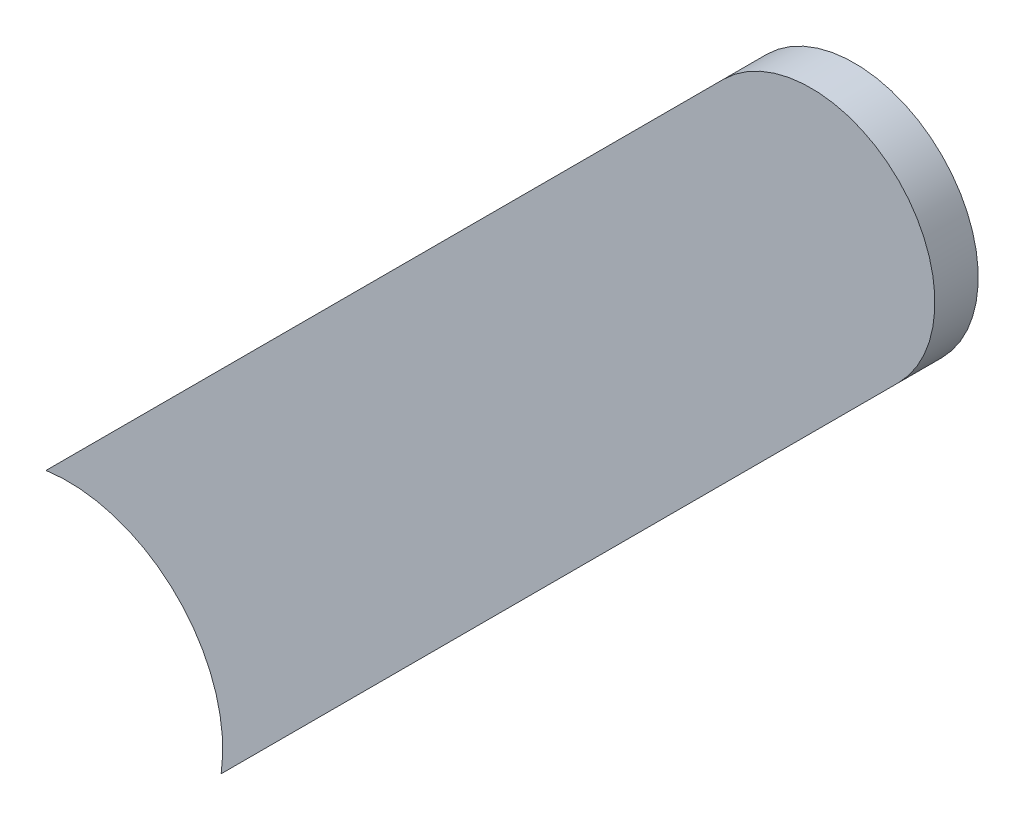
ISO-10303-21;
HEADER;
FILE_DESCRIPTION(('STEP AP214'),'2;1');
FILE_NAME('part.step','',(''),(''),'','','');
FILE_SCHEMA(('AUTOMOTIVE_DESIGN { 1 0 10303 214 1 1 1 1 }'));
ENDSEC;
DATA;
#1=APPLICATION_CONTEXT('core data for automotive mechanical design processes');
#2=APPLICATION_PROTOCOL_DEFINITION('international standard','automotive_design',2000,#1);
#3=PRODUCT_CONTEXT('',#1,'mechanical');
#4=PRODUCT('Part','Part','',(#3));
#5=PRODUCT_RELATED_PRODUCT_CATEGORY('part','',(#4));
#6=PRODUCT_DEFINITION_FORMATION('','',#4);
#7=PRODUCT_DEFINITION_CONTEXT('part definition',#1,'design');
#8=PRODUCT_DEFINITION('design','',#6,#7);
#9=PRODUCT_DEFINITION_SHAPE('','',#8);
#10=(LENGTH_UNIT() NAMED_UNIT(*) SI_UNIT(.MILLI.,.METRE.));
#11=(NAMED_UNIT(*) PLANE_ANGLE_UNIT() SI_UNIT($,.RADIAN.));
#12=(NAMED_UNIT(*) SI_UNIT($,.STERADIAN.) SOLID_ANGLE_UNIT());
#13=UNCERTAINTY_MEASURE_WITH_UNIT(LENGTH_MEASURE(1.E-05),#10,'distance_accuracy_value','');
#14=(GEOMETRIC_REPRESENTATION_CONTEXT(3) GLOBAL_UNCERTAINTY_ASSIGNED_CONTEXT((#13)) GLOBAL_UNIT_ASSIGNED_CONTEXT((#10,
#11,#12)) REPRESENTATION_CONTEXT('',''));
#15=CARTESIAN_POINT('',(0.,0.,0.));
#16=DIRECTION('',(0.,0.,1.));
#17=DIRECTION('',(1.,0.,0.));
#18=AXIS2_PLACEMENT_3D('',#15,#16,#17);
#19=CARTESIAN_POINT('',(90.629289,-121.979289,1.6));
#20=DIRECTION('',(0.707106781186548,-0.707106781186548,0.));
#21=DIRECTION('',(0.,0.,-1.));
#22=AXIS2_PLACEMENT_3D('',#19,#20,#21);
#23=PLANE('',#22);
#24=DIRECTION('',(0.,0.,-1.));
#25=VECTOR('',#24,1.);
#26=CARTESIAN_POINT('',(90.082321579411,-122.5262564205,-0.045));
#27=LINE('',#26,#25);
#28=CARTESIAN_POINT('',(90.082321579386,-122.5262564206,1.635));
#29=VERTEX_POINT('',#28);
#30=CARTESIAN_POINT('',(90.082321579386,-122.5262564206,1.6));
#31=VERTEX_POINT('',#30);
#32=EDGE_CURVE('E11',#29,#31,#27,.T.);
#33=ORIENTED_EDGE('',*,*,#32,.F.);
#34=DIRECTION('',(-0.707106781186548,-0.707106781186548,0.));
#35=VECTOR('',#34,1.);
#36=CARTESIAN_POINT('',(90.629289,-121.979289,1.635));
#37=LINE('',#36,#35);
#38=CARTESIAN_POINT('',(90.629289,-121.979289,1.635));
#39=VERTEX_POINT('',#38);
#40=EDGE_CURVE('E26',#39,#29,#37,.T.);
#41=ORIENTED_EDGE('',*,*,#40,.F.);
#42=DIRECTION('',(0.,0.,1.));
#43=VECTOR('',#42,1.);
#44=CARTESIAN_POINT('',(90.629289,-121.979289,1.6));
#45=LINE('',#44,#43);
#46=CARTESIAN_POINT('',(90.629289,-121.979289,1.6));
#47=VERTEX_POINT('',#46);
#48=EDGE_CURVE('E67',#47,#39,#45,.T.);
#49=ORIENTED_EDGE('',*,*,#48,.F.);
#50=DIRECTION('',(-0.707106781186548,-0.707106781186548,0.));
#51=VECTOR('',#50,1.);
#52=CARTESIAN_POINT('',(90.629289,-121.979289,1.6));
#53=LINE('',#52,#51);
#54=EDGE_CURVE('E70',#47,#31,#53,.T.);
#55=ORIENTED_EDGE('',*,*,#54,.T.);
#56=EDGE_LOOP('',(#33,#41,#49,#55));
#57=FACE_BOUND('',#56,.T.);
#58=ADVANCED_FACE('F17',(#57),#23,.F.);
#59=CARTESIAN_POINT('',(90.1,-122.65,-0.045));
#60=DIRECTION('',(0.,0.,-1.));
#61=DIRECTION('',(0.,-1.,0.));
#62=AXIS2_PLACEMENT_3D('',#59,#60,#61);
#63=CYLINDRICAL_SURFACE('',#62,0.125);
#64=DIRECTION('',(0.,0.,-1.));
#65=VECTOR('',#64,1.);
#66=CARTESIAN_POINT('',(90.223743912735,-122.6676760872,-0.045));
#67=LINE('',#66,#65);
#68=CARTESIAN_POINT('',(90.223743912733,-122.6676760872,1.635));
#69=VERTEX_POINT('',#68);
#70=CARTESIAN_POINT('',(90.223743912733,-122.6676760872,1.6));
#71=VERTEX_POINT('',#70);
#72=EDGE_CURVE('E95',#69,#71,#67,.T.);
#73=ORIENTED_EDGE('',*,*,#72,.F.);
#74=CARTESIAN_POINT('',(90.1,-122.65,1.635));
#75=DIRECTION('',(0.,0.,-1.));
#76=DIRECTION('',(0.,-1.,0.));
#77=AXIS2_PLACEMENT_3D('',#74,#75,#76);
#78=CIRCLE('',#77,0.125);
#79=EDGE_CURVE('E20',#29,#69,#78,.T.);
#80=ORIENTED_EDGE('',*,*,#79,.F.);
#81=ORIENTED_EDGE('',*,*,#32,.T.);
#82=CARTESIAN_POINT('',(90.1,-122.65,1.6));
#83=DIRECTION('',(0.,0.,-1.));
#84=DIRECTION('',(0.,-1.,0.));
#85=AXIS2_PLACEMENT_3D('',#82,#83,#84);
#86=CIRCLE('',#85,0.125);
#87=EDGE_CURVE('E74',#31,#71,#86,.T.);
#88=ORIENTED_EDGE('',*,*,#87,.T.);
#89=EDGE_LOOP('',(#73,#80,#81,#88));
#90=FACE_BOUND('',#89,.T.);
#91=ADVANCED_FACE('F126',(#90),#63,.F.);
#92=CARTESIAN_POINT('',(90.17071,-122.72071,1.635));
#93=DIRECTION('',(0.,0.,1.));
#94=DIRECTION('',(1.,0.,0.));
#95=AXIS2_PLACEMENT_3D('',#92,#93,#94);
#96=PLANE('',#95);
#97=ORIENTED_EDGE('',*,*,#79,.T.);
#98=DIRECTION('',(0.707106781186548,0.707106781186548,0.));
#99=VECTOR('',#98,1.);
#100=CARTESIAN_POINT('',(90.17071,-122.72071,1.635));
#101=LINE('',#100,#99);
#102=CARTESIAN_POINT('',(90.77071,-122.12071,1.635));
#103=VERTEX_POINT('',#102);
#104=EDGE_CURVE('E115',#69,#103,#101,.T.);
#105=ORIENTED_EDGE('',*,*,#104,.T.);
#106=CARTESIAN_POINT('',(90.6999995,-122.0499995,1.635));
#107=DIRECTION('',(0.,0.,1.));
#108=DIRECTION('',(0.707106781186548,-0.707106781186548,0.));
#109=AXIS2_PLACEMENT_3D('',#106,#107,#108);
#110=CIRCLE('',#109,0.09999974810219);
#111=EDGE_CURVE('E73',#103,#39,#110,.T.);
#112=ORIENTED_EDGE('',*,*,#111,.T.);
#113=ORIENTED_EDGE('',*,*,#40,.T.);
#114=EDGE_LOOP('',(#97,#105,#112,#113));
#115=FACE_BOUND('',#114,.T.);
#116=ADVANCED_FACE('F128',(#115),#96,.T.);
#117=CARTESIAN_POINT('',(90.6999995,-122.0499995,1.6));
#118=DIRECTION('',(0.,0.,-1.));
#119=DIRECTION('',(0.707106781186548,-0.707106781186548,0.));
#120=AXIS2_PLACEMENT_3D('',#117,#118,#119);
#121=CYLINDRICAL_SURFACE('',#120,0.09999974810219);
#122=CARTESIAN_POINT('',(90.6999995,-122.0499995,1.6));
#123=DIRECTION('',(0.,0.,1.));
#124=DIRECTION('',(0.707106781186548,-0.707106781186548,0.));
#125=AXIS2_PLACEMENT_3D('',#122,#123,#124);
#126=CIRCLE('',#125,0.09999974810219);
#127=CARTESIAN_POINT('',(90.77071,-122.12071,1.6));
#128=VERTEX_POINT('',#127);
#129=EDGE_CURVE('E77',#128,#47,#126,.T.);
#130=ORIENTED_EDGE('',*,*,#129,.T.);
#131=ORIENTED_EDGE('',*,*,#48,.T.);
#132=ORIENTED_EDGE('',*,*,#111,.F.);
#133=DIRECTION('',(0.,0.,1.));
#134=VECTOR('',#133,1.);
#135=CARTESIAN_POINT('',(90.77071,-122.12071,1.6));
#136=LINE('',#135,#134);
#137=EDGE_CURVE('E80',#128,#103,#136,.T.);
#138=ORIENTED_EDGE('',*,*,#137,.F.);
#139=EDGE_LOOP('',(#130,#131,#132,#138));
#140=FACE_BOUND('',#139,.T.);
#141=ADVANCED_FACE('F78',(#140),#121,.T.);
#142=CARTESIAN_POINT('',(90.17071,-122.72071,1.6));
#143=DIRECTION('',(0.,0.,1.));
#144=DIRECTION('',(1.,0.,0.));
#145=AXIS2_PLACEMENT_3D('',#142,#143,#144);
#146=PLANE('',#145);
#147=ORIENTED_EDGE('',*,*,#54,.F.);
#148=ORIENTED_EDGE('',*,*,#129,.F.);
#149=DIRECTION('',(0.707106781186548,0.707106781186548,0.));
#150=VECTOR('',#149,1.);
#151=CARTESIAN_POINT('',(90.17071,-122.72071,1.6));
#152=LINE('',#151,#150);
#153=EDGE_CURVE('E89',#71,#128,#152,.T.);
#154=ORIENTED_EDGE('',*,*,#153,.F.);
#155=ORIENTED_EDGE('',*,*,#87,.F.);
#156=EDGE_LOOP('',(#147,#148,#154,#155));
#157=FACE_BOUND('',#156,.T.);
#158=ADVANCED_FACE('F87',(#157),#146,.F.);
#159=CARTESIAN_POINT('',(90.17071,-122.72071,1.6));
#160=DIRECTION('',(-0.707106781186548,0.707106781186548,0.));
#161=DIRECTION('',(0.,0.,1.));
#162=AXIS2_PLACEMENT_3D('',#159,#160,#161);
#163=PLANE('',#162);
#164=ORIENTED_EDGE('',*,*,#137,.T.);
#165=ORIENTED_EDGE('',*,*,#104,.F.);
#166=ORIENTED_EDGE('',*,*,#72,.T.);
#167=ORIENTED_EDGE('',*,*,#153,.T.);
#168=EDGE_LOOP('',(#164,#165,#166,#167));
#169=FACE_BOUND('',#168,.T.);
#170=ADVANCED_FACE('F124',(#169),#163,.F.);
#171=CLOSED_SHELL('',(#58,#91,#116,#141,#158,#170));
#172=MANIFOLD_SOLID_BREP('B1',#171);
#173=ADVANCED_BREP_SHAPE_REPRESENTATION('',(#18,#172),#14);
#174=SHAPE_DEFINITION_REPRESENTATION(#9,#173);
ENDSEC;
END-ISO-10303-21;
